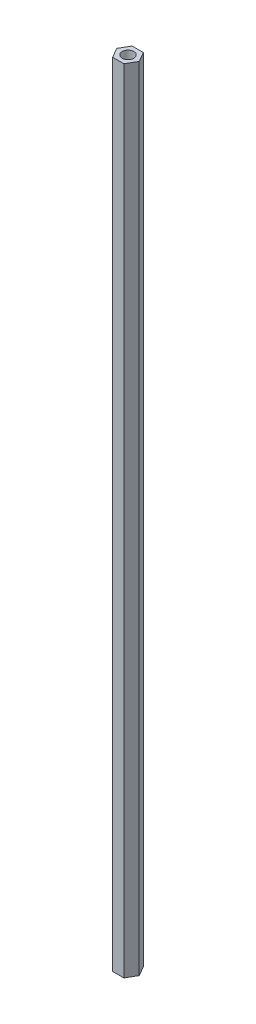
ISO-10303-21;
HEADER;
FILE_DESCRIPTION(('STEP AP214'),'2;1');
FILE_NAME('part.step','',(''),(''),'','','');
FILE_SCHEMA(('AUTOMOTIVE_DESIGN { 1 0 10303 214 1 1 1 1 }'));
ENDSEC;
DATA;
#1=APPLICATION_CONTEXT('core data for automotive mechanical design processes');
#2=APPLICATION_PROTOCOL_DEFINITION('international standard','automotive_design',2000,#1);
#3=PRODUCT_CONTEXT('',#1,'mechanical');
#4=PRODUCT('Part','Part','',(#3));
#5=PRODUCT_RELATED_PRODUCT_CATEGORY('part','',(#4));
#6=PRODUCT_DEFINITION_FORMATION('','',#4);
#7=PRODUCT_DEFINITION_CONTEXT('part definition',#1,'design');
#8=PRODUCT_DEFINITION('design','',#6,#7);
#9=PRODUCT_DEFINITION_SHAPE('','',#8);
#10=(LENGTH_UNIT() NAMED_UNIT(*) SI_UNIT(.MILLI.,.METRE.));
#11=(NAMED_UNIT(*) PLANE_ANGLE_UNIT() SI_UNIT($,.RADIAN.));
#12=(NAMED_UNIT(*) SI_UNIT($,.STERADIAN.) SOLID_ANGLE_UNIT());
#13=UNCERTAINTY_MEASURE_WITH_UNIT(LENGTH_MEASURE(1.E-05),#10,'distance_accuracy_value','');
#14=(GEOMETRIC_REPRESENTATION_CONTEXT(3) GLOBAL_UNCERTAINTY_ASSIGNED_CONTEXT((#13)) GLOBAL_UNIT_ASSIGNED_CONTEXT((#10,
#11,#12)) REPRESENTATION_CONTEXT('',''));
#15=CARTESIAN_POINT('',(0.,0.,0.));
#16=DIRECTION('',(0.,0.,1.));
#17=DIRECTION('',(1.,0.,0.));
#18=AXIS2_PLACEMENT_3D('',#15,#16,#17);
#19=CARTESIAN_POINT('',(1.44337567297408,203.2,2.49999999999999));
#20=DIRECTION('',(-0.86602540378444,0.,-0.499999999999998));
#21=DIRECTION('',(-0.499999999999998,0.,0.86602540378444));
#22=AXIS2_PLACEMENT_3D('',#19,#20,#21);
#23=PLANE('',#22);
#24=DIRECTION('',(0.499999999999998,0.,-0.86602540378444));
#25=VECTOR('',#24,1.);
#26=CARTESIAN_POINT('',(1.44337567297408,0.,2.49999999999999));
#27=LINE('',#26,#25);
#28=CARTESIAN_POINT('',(1.44337567297408,0.,2.49999999999999));
#29=VERTEX_POINT('',#28);
#30=CARTESIAN_POINT('',(2.88675134594811,0.,0.));
#31=VERTEX_POINT('',#30);
#32=EDGE_CURVE('E121',#29,#31,#27,.T.);
#33=ORIENTED_EDGE('',*,*,#32,.T.);
#34=DIRECTION('',(0.,-1.,0.));
#35=VECTOR('',#34,1.);
#36=CARTESIAN_POINT('',(2.88675134594811,203.2,0.));
#37=LINE('',#36,#35);
#38=CARTESIAN_POINT('',(2.88675134594811,203.2,0.));
#39=VERTEX_POINT('',#38);
#40=EDGE_CURVE('E11',#39,#31,#37,.T.);
#41=ORIENTED_EDGE('',*,*,#40,.F.);
#42=DIRECTION('',(0.499999999999998,0.,-0.86602540378444));
#43=VECTOR('',#42,1.);
#44=CARTESIAN_POINT('',(1.44337567297408,203.2,2.49999999999999));
#45=LINE('',#44,#43);
#46=CARTESIAN_POINT('',(1.44337567297408,203.2,2.49999999999999));
#47=VERTEX_POINT('',#46);
#48=EDGE_CURVE('E132',#47,#39,#45,.T.);
#49=ORIENTED_EDGE('',*,*,#48,.F.);
#50=DIRECTION('',(0.,-1.,0.));
#51=VECTOR('',#50,1.);
#52=CARTESIAN_POINT('',(1.44337567297408,203.2,2.49999999999999));
#53=LINE('',#52,#51);
#54=EDGE_CURVE('E117',#47,#29,#53,.T.);
#55=ORIENTED_EDGE('',*,*,#54,.T.);
#56=EDGE_LOOP('',(#33,#41,#49,#55));
#57=FACE_BOUND('',#56,.T.);
#58=ADVANCED_FACE('F37',(#57),#23,.F.);
#59=CARTESIAN_POINT('',(2.88675134594811,203.2,0.));
#60=DIRECTION('',(-0.86602540378444,0.,0.499999999999997));
#61=DIRECTION('',(0.499999999999998,0.,0.86602540378444));
#62=AXIS2_PLACEMENT_3D('',#59,#60,#61);
#63=PLANE('',#62);
#64=DIRECTION('',(-0.499999999999997,0.,-0.86602540378444));
#65=VECTOR('',#64,1.);
#66=CARTESIAN_POINT('',(2.88675134594811,0.,0.));
#67=LINE('',#66,#65);
#68=CARTESIAN_POINT('',(1.44337567297403,0.,-2.50000000000001));
#69=VERTEX_POINT('',#68);
#70=EDGE_CURVE('E124',#31,#69,#67,.T.);
#71=ORIENTED_EDGE('',*,*,#70,.T.);
#72=DIRECTION('',(0.,-1.,0.));
#73=VECTOR('',#72,1.);
#74=CARTESIAN_POINT('',(1.44337567297403,203.2,-2.50000000000001));
#75=LINE('',#74,#73);
#76=CARTESIAN_POINT('',(1.44337567297403,203.2,-2.50000000000001));
#77=VERTEX_POINT('',#76);
#78=EDGE_CURVE('E45',#77,#69,#75,.T.);
#79=ORIENTED_EDGE('',*,*,#78,.F.);
#80=DIRECTION('',(-0.499999999999997,0.,-0.86602540378444));
#81=VECTOR('',#80,1.);
#82=CARTESIAN_POINT('',(2.88675134594811,203.2,0.));
#83=LINE('',#82,#81);
#84=EDGE_CURVE('E90',#39,#77,#83,.T.);
#85=ORIENTED_EDGE('',*,*,#84,.F.);
#86=ORIENTED_EDGE('',*,*,#40,.T.);
#87=EDGE_LOOP('',(#71,#79,#85,#86));
#88=FACE_BOUND('',#87,.T.);
#89=ADVANCED_FACE('F157',(#88),#63,.F.);
#90=CARTESIAN_POINT('',(1.44337567297403,203.2,-2.50000000000001));
#91=DIRECTION('',(0.,0.,1.));
#92=DIRECTION('',(1.,0.,0.));
#93=AXIS2_PLACEMENT_3D('',#90,#91,#92);
#94=PLANE('',#93);
#95=DIRECTION('',(-1.,0.,0.));
#96=VECTOR('',#95,1.);
#97=CARTESIAN_POINT('',(1.44337567297403,0.,-2.50000000000001));
#98=LINE('',#97,#96);
#99=CARTESIAN_POINT('',(-1.44337567297408,0.,-2.5));
#100=VERTEX_POINT('',#99);
#101=EDGE_CURVE('E127',#69,#100,#98,.T.);
#102=ORIENTED_EDGE('',*,*,#101,.T.);
#103=DIRECTION('',(0.,-1.,0.));
#104=VECTOR('',#103,1.);
#105=CARTESIAN_POINT('',(-1.44337567297408,203.2,-2.5));
#106=LINE('',#105,#104);
#107=CARTESIAN_POINT('',(-1.44337567297408,203.2,-2.5));
#108=VERTEX_POINT('',#107);
#109=EDGE_CURVE('E112',#108,#100,#106,.T.);
#110=ORIENTED_EDGE('',*,*,#109,.F.);
#111=DIRECTION('',(-1.,0.,0.));
#112=VECTOR('',#111,1.);
#113=CARTESIAN_POINT('',(1.44337567297403,203.2,-2.50000000000001));
#114=LINE('',#113,#112);
#115=EDGE_CURVE('E103',#77,#108,#114,.T.);
#116=ORIENTED_EDGE('',*,*,#115,.F.);
#117=ORIENTED_EDGE('',*,*,#78,.T.);
#118=EDGE_LOOP('',(#102,#110,#116,#117));
#119=FACE_BOUND('',#118,.T.);
#120=ADVANCED_FACE('F138',(#119),#94,.F.);
#121=CARTESIAN_POINT('',(-1.44337567297408,203.2,-2.5));
#122=DIRECTION('',(0.866025403784438,0.,0.500000000000002));
#123=DIRECTION('',(0.500000000000002,0.,-0.866025403784438));
#124=AXIS2_PLACEMENT_3D('',#121,#122,#123);
#125=PLANE('',#124);
#126=DIRECTION('',(-0.500000000000002,0.,0.866025403784438));
#127=VECTOR('',#126,1.);
#128=CARTESIAN_POINT('',(-1.44337567297408,0.,-2.5));
#129=LINE('',#128,#127);
#130=CARTESIAN_POINT('',(-2.88675134594814,0.,0.));
#131=VERTEX_POINT('',#130);
#132=EDGE_CURVE('E111',#100,#131,#129,.T.);
#133=ORIENTED_EDGE('',*,*,#132,.T.);
#134=DIRECTION('',(0.,-1.,0.));
#135=VECTOR('',#134,1.);
#136=CARTESIAN_POINT('',(-2.88675134594814,203.2,0.));
#137=LINE('',#136,#135);
#138=CARTESIAN_POINT('',(-2.88675134594814,203.2,0.));
#139=VERTEX_POINT('',#138);
#140=EDGE_CURVE('E108',#139,#131,#137,.T.);
#141=ORIENTED_EDGE('',*,*,#140,.F.);
#142=DIRECTION('',(-0.500000000000002,0.,0.866025403784438));
#143=VECTOR('',#142,1.);
#144=CARTESIAN_POINT('',(-1.44337567297408,203.2,-2.5));
#145=LINE('',#144,#143);
#146=EDGE_CURVE('E97',#108,#139,#145,.T.);
#147=ORIENTED_EDGE('',*,*,#146,.F.);
#148=ORIENTED_EDGE('',*,*,#109,.T.);
#149=EDGE_LOOP('',(#133,#141,#147,#148));
#150=FACE_BOUND('',#149,.T.);
#151=ADVANCED_FACE('F109',(#150),#125,.F.);
#152=CARTESIAN_POINT('',(-2.88675134594814,203.2,0.));
#153=DIRECTION('',(0.866025403784437,0.,-0.500000000000002));
#154=DIRECTION('',(-0.500000000000002,0.,-0.866025403784438));
#155=AXIS2_PLACEMENT_3D('',#152,#153,#154);
#156=PLANE('',#155);
#157=DIRECTION('',(0.500000000000002,0.,0.866025403784438));
#158=VECTOR('',#157,1.);
#159=CARTESIAN_POINT('',(-2.88675134594814,0.,0.));
#160=LINE('',#159,#158);
#161=CARTESIAN_POINT('',(-1.44337567297406,0.,2.5));
#162=VERTEX_POINT('',#161);
#163=EDGE_CURVE('E76',#131,#162,#160,.T.);
#164=ORIENTED_EDGE('',*,*,#163,.T.);
#165=DIRECTION('',(0.,-1.,0.));
#166=VECTOR('',#165,1.);
#167=CARTESIAN_POINT('',(-1.44337567297406,203.2,2.5));
#168=LINE('',#167,#166);
#169=CARTESIAN_POINT('',(-1.44337567297406,203.2,2.5));
#170=VERTEX_POINT('',#169);
#171=EDGE_CURVE('E113',#170,#162,#168,.T.);
#172=ORIENTED_EDGE('',*,*,#171,.F.);
#173=DIRECTION('',(0.500000000000002,0.,0.866025403784438));
#174=VECTOR('',#173,1.);
#175=CARTESIAN_POINT('',(-2.88675134594814,203.2,0.));
#176=LINE('',#175,#174);
#177=EDGE_CURVE('E101',#139,#170,#176,.T.);
#178=ORIENTED_EDGE('',*,*,#177,.F.);
#179=ORIENTED_EDGE('',*,*,#140,.T.);
#180=EDGE_LOOP('',(#164,#172,#178,#179));
#181=FACE_BOUND('',#180,.T.);
#182=ADVANCED_FACE('F115',(#181),#156,.F.);
#183=CARTESIAN_POINT('',(-1.44337567297406,203.2,2.5));
#184=DIRECTION('',(0.,0.,-1.));
#185=DIRECTION('',(-1.,0.,0.));
#186=AXIS2_PLACEMENT_3D('',#183,#184,#185);
#187=PLANE('',#186);
#188=DIRECTION('',(1.,0.,0.));
#189=VECTOR('',#188,1.);
#190=CARTESIAN_POINT('',(-1.44337567297406,0.,2.5));
#191=LINE('',#190,#189);
#192=EDGE_CURVE('E82',#162,#29,#191,.T.);
#193=ORIENTED_EDGE('',*,*,#192,.T.);
#194=ORIENTED_EDGE('',*,*,#54,.F.);
#195=DIRECTION('',(1.,0.,0.));
#196=VECTOR('',#195,1.);
#197=CARTESIAN_POINT('',(-1.44337567297406,203.2,2.5));
#198=LINE('',#197,#196);
#199=EDGE_CURVE('E53',#170,#47,#198,.T.);
#200=ORIENTED_EDGE('',*,*,#199,.F.);
#201=ORIENTED_EDGE('',*,*,#171,.T.);
#202=EDGE_LOOP('',(#193,#194,#200,#201));
#203=FACE_BOUND('',#202,.T.);
#204=ADVANCED_FACE('F145',(#203),#187,.F.);
#205=CARTESIAN_POINT('',(0.,203.2,0.));
#206=DIRECTION('',(0.,1.,0.));
#207=DIRECTION('',(0.,0.,1.));
#208=AXIS2_PLACEMENT_3D('',#205,#206,#207);
#209=PLANE('',#208);
#210=CARTESIAN_POINT('',(0.,203.2,0.));
#211=DIRECTION('',(0.,1.,0.));
#212=DIRECTION('',(0.,0.,1.));
#213=AXIS2_PLACEMENT_3D('',#210,#211,#212);
#214=CIRCLE('',#213,1.5);
#215=CARTESIAN_POINT('',(0.,203.2,1.5));
#216=VERTEX_POINT('',#215);
#217=EDGE_CURVE('E244',#216,#216,#214,.T.);
#218=ORIENTED_EDGE('',*,*,#217,.F.);
#219=EDGE_LOOP('',(#218));
#220=FACE_BOUND('',#219,.T.);
#221=ORIENTED_EDGE('',*,*,#48,.T.);
#222=ORIENTED_EDGE('',*,*,#84,.T.);
#223=ORIENTED_EDGE('',*,*,#115,.T.);
#224=ORIENTED_EDGE('',*,*,#146,.T.);
#225=ORIENTED_EDGE('',*,*,#177,.T.);
#226=ORIENTED_EDGE('',*,*,#199,.T.);
#227=EDGE_LOOP('',(#221,#222,#223,#224,#225,#226));
#228=FACE_BOUND('',#227,.T.);
#229=ADVANCED_FACE('F99',(#220,#228),#209,.T.);
#230=CARTESIAN_POINT('',(0.,0.,0.));
#231=DIRECTION('',(0.,1.,0.));
#232=DIRECTION('',(0.,0.,1.));
#233=AXIS2_PLACEMENT_3D('',#230,#231,#232);
#234=PLANE('',#233);
#235=CARTESIAN_POINT('',(0.,0.,0.));
#236=DIRECTION('',(0.,1.,0.));
#237=DIRECTION('',(0.,0.,1.));
#238=AXIS2_PLACEMENT_3D('',#235,#236,#237);
#239=CIRCLE('',#238,1.5);
#240=CARTESIAN_POINT('',(0.,0.,1.5));
#241=VERTEX_POINT('',#240);
#242=EDGE_CURVE('E125',#241,#241,#239,.T.);
#243=ORIENTED_EDGE('',*,*,#242,.T.);
#244=EDGE_LOOP('',(#243));
#245=FACE_BOUND('',#244,.T.);
#246=ORIENTED_EDGE('',*,*,#32,.F.);
#247=ORIENTED_EDGE('',*,*,#192,.F.);
#248=ORIENTED_EDGE('',*,*,#163,.F.);
#249=ORIENTED_EDGE('',*,*,#132,.F.);
#250=ORIENTED_EDGE('',*,*,#101,.F.);
#251=ORIENTED_EDGE('',*,*,#70,.F.);
#252=EDGE_LOOP('',(#246,#247,#248,#249,#250,#251));
#253=FACE_BOUND('',#252,.T.);
#254=ADVANCED_FACE('F141',(#245,#253),#234,.F.);
#255=CARTESIAN_POINT('',(0.,0.,0.));
#256=DIRECTION('',(0.,1.,0.));
#257=DIRECTION('',(0.,0.,1.));
#258=AXIS2_PLACEMENT_3D('',#255,#256,#257);
#259=CYLINDRICAL_SURFACE('',#258,1.5);
#260=ORIENTED_EDGE('',*,*,#242,.F.);
#261=EDGE_LOOP('',(#260));
#262=FACE_BOUND('',#261,.T.);
#263=ORIENTED_EDGE('',*,*,#217,.T.);
#264=EDGE_LOOP('',(#263));
#265=FACE_BOUND('',#264,.T.);
#266=ADVANCED_FACE('F197',(#262,#265),#259,.F.);
#267=CLOSED_SHELL('',(#58,#89,#120,#151,#182,#204,#229,#254,#266));
#268=MANIFOLD_SOLID_BREP('B2',#267);
#269=ADVANCED_BREP_SHAPE_REPRESENTATION('',(#18,#268),#14);
#270=SHAPE_DEFINITION_REPRESENTATION(#9,#269);
ENDSEC;
END-ISO-10303-21;
